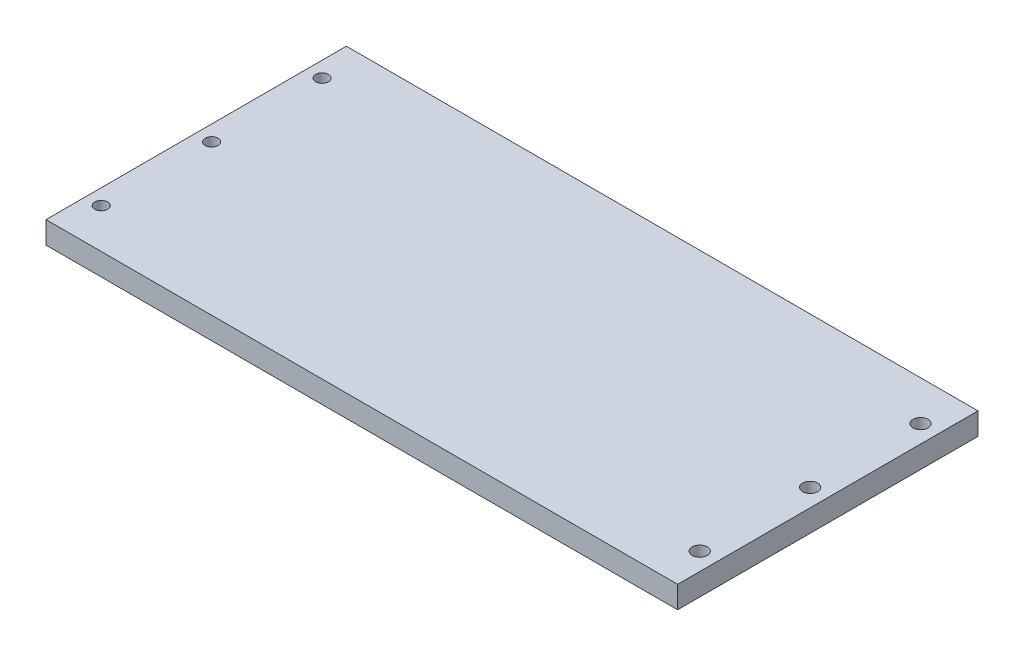
ISO-10303-21;
HEADER;
FILE_DESCRIPTION(('STEP AP214'),'2;1');
FILE_NAME('part.step','',(''),(''),'','','');
FILE_SCHEMA(('AUTOMOTIVE_DESIGN { 1 0 10303 214 1 1 1 1 }'));
ENDSEC;
DATA;
#1=APPLICATION_CONTEXT('core data for automotive mechanical design processes');
#2=APPLICATION_PROTOCOL_DEFINITION('international standard','automotive_design',2000,#1);
#3=PRODUCT_CONTEXT('',#1,'mechanical');
#4=PRODUCT('Part','Part','',(#3));
#5=PRODUCT_RELATED_PRODUCT_CATEGORY('part','',(#4));
#6=PRODUCT_DEFINITION_FORMATION('','',#4);
#7=PRODUCT_DEFINITION_CONTEXT('part definition',#1,'design');
#8=PRODUCT_DEFINITION('design','',#6,#7);
#9=PRODUCT_DEFINITION_SHAPE('','',#8);
#10=(LENGTH_UNIT() NAMED_UNIT(*) SI_UNIT(.MILLI.,.METRE.));
#11=(NAMED_UNIT(*) PLANE_ANGLE_UNIT() SI_UNIT($,.RADIAN.));
#12=(NAMED_UNIT(*) SI_UNIT($,.STERADIAN.) SOLID_ANGLE_UNIT());
#13=UNCERTAINTY_MEASURE_WITH_UNIT(LENGTH_MEASURE(1.E-05),#10,'distance_accuracy_value','');
#14=(GEOMETRIC_REPRESENTATION_CONTEXT(3) GLOBAL_UNCERTAINTY_ASSIGNED_CONTEXT((#13)) GLOBAL_UNIT_ASSIGNED_CONTEXT((#10,
#11,#12)) REPRESENTATION_CONTEXT('',''));
#15=CARTESIAN_POINT('',(0.,0.,0.));
#16=DIRECTION('',(0.,0.,1.));
#17=DIRECTION('',(1.,0.,0.));
#18=AXIS2_PLACEMENT_3D('',#15,#16,#17);
#19=CARTESIAN_POINT('',(71.5,5.,34.));
#20=DIRECTION('',(-1.,0.,0.));
#21=DIRECTION('',(0.,0.,1.));
#22=AXIS2_PLACEMENT_3D('',#19,#20,#21);
#23=PLANE('',#22);
#24=DIRECTION('',(0.,0.,-1.));
#25=VECTOR('',#24,1.);
#26=CARTESIAN_POINT('',(71.5,0.,34.));
#27=LINE('',#26,#25);
#28=CARTESIAN_POINT('',(71.5,0.,34.));
#29=VERTEX_POINT('',#28);
#30=CARTESIAN_POINT('',(71.5,0.,-34.));
#31=VERTEX_POINT('',#30);
#32=EDGE_CURVE('E108',#29,#31,#27,.T.);
#33=ORIENTED_EDGE('',*,*,#32,.T.);
#34=DIRECTION('',(0.,-1.,0.));
#35=VECTOR('',#34,1.);
#36=CARTESIAN_POINT('',(71.5,5.,-34.));
#37=LINE('',#36,#35);
#38=CARTESIAN_POINT('',(71.5,5.,-34.));
#39=VERTEX_POINT('',#38);
#40=EDGE_CURVE('E13',#39,#31,#37,.T.);
#41=ORIENTED_EDGE('',*,*,#40,.F.);
#42=DIRECTION('',(0.,0.,-1.));
#43=VECTOR('',#42,1.);
#44=CARTESIAN_POINT('',(71.5,5.,34.));
#45=LINE('',#44,#43);
#46=CARTESIAN_POINT('',(71.5,5.,34.));
#47=VERTEX_POINT('',#46);
#48=EDGE_CURVE('E96',#47,#39,#45,.T.);
#49=ORIENTED_EDGE('',*,*,#48,.F.);
#50=DIRECTION('',(0.,-1.,0.));
#51=VECTOR('',#50,1.);
#52=CARTESIAN_POINT('',(71.5,5.,34.));
#53=LINE('',#52,#51);
#54=EDGE_CURVE('E104',#47,#29,#53,.T.);
#55=ORIENTED_EDGE('',*,*,#54,.T.);
#56=EDGE_LOOP('',(#33,#41,#49,#55));
#57=FACE_BOUND('',#56,.T.);
#58=ADVANCED_FACE('F45',(#57),#23,.F.);
#59=CARTESIAN_POINT('',(-71.5,5.,-34.));
#60=DIRECTION('',(0.,0.,1.));
#61=DIRECTION('',(1.,0.,0.));
#62=AXIS2_PLACEMENT_3D('',#59,#60,#61);
#63=PLANE('',#62);
#64=DIRECTION('',(-1.,0.,0.));
#65=VECTOR('',#64,1.);
#66=CARTESIAN_POINT('',(-71.5,0.,-34.));
#67=LINE('',#66,#65);
#68=CARTESIAN_POINT('',(-71.5,0.,-34.));
#69=VERTEX_POINT('',#68);
#70=EDGE_CURVE('E100',#31,#69,#67,.T.);
#71=ORIENTED_EDGE('',*,*,#70,.T.);
#72=DIRECTION('',(0.,-1.,0.));
#73=VECTOR('',#72,1.);
#74=CARTESIAN_POINT('',(-71.5,5.,-34.));
#75=LINE('',#74,#73);
#76=CARTESIAN_POINT('',(-71.5,5.,-34.));
#77=VERTEX_POINT('',#76);
#78=EDGE_CURVE('E53',#77,#69,#75,.T.);
#79=ORIENTED_EDGE('',*,*,#78,.F.);
#80=DIRECTION('',(-1.,0.,0.));
#81=VECTOR('',#80,1.);
#82=CARTESIAN_POINT('',(-71.5,5.,-34.));
#83=LINE('',#82,#81);
#84=EDGE_CURVE('E91',#39,#77,#83,.T.);
#85=ORIENTED_EDGE('',*,*,#84,.F.);
#86=ORIENTED_EDGE('',*,*,#40,.T.);
#87=EDGE_LOOP('',(#71,#79,#85,#86));
#88=FACE_BOUND('',#87,.T.);
#89=ADVANCED_FACE('F99',(#88),#63,.F.);
#90=CARTESIAN_POINT('',(-71.5,5.,34.));
#91=DIRECTION('',(1.,0.,0.));
#92=DIRECTION('',(0.,0.,-1.));
#93=AXIS2_PLACEMENT_3D('',#90,#91,#92);
#94=PLANE('',#93);
#95=DIRECTION('',(0.,0.,1.));
#96=VECTOR('',#95,1.);
#97=CARTESIAN_POINT('',(-71.5,0.,34.));
#98=LINE('',#97,#96);
#99=CARTESIAN_POINT('',(-71.5,0.,34.));
#100=VERTEX_POINT('',#99);
#101=EDGE_CURVE('E78',#69,#100,#98,.T.);
#102=ORIENTED_EDGE('',*,*,#101,.T.);
#103=DIRECTION('',(0.,-1.,0.));
#104=VECTOR('',#103,1.);
#105=CARTESIAN_POINT('',(-71.5,5.,34.));
#106=LINE('',#105,#104);
#107=CARTESIAN_POINT('',(-71.5,5.,34.));
#108=VERTEX_POINT('',#107);
#109=EDGE_CURVE('E101',#108,#100,#106,.T.);
#110=ORIENTED_EDGE('',*,*,#109,.F.);
#111=DIRECTION('',(0.,0.,1.));
#112=VECTOR('',#111,1.);
#113=CARTESIAN_POINT('',(-71.5,5.,34.));
#114=LINE('',#113,#112);
#115=EDGE_CURVE('E94',#77,#108,#114,.T.);
#116=ORIENTED_EDGE('',*,*,#115,.F.);
#117=ORIENTED_EDGE('',*,*,#78,.T.);
#118=EDGE_LOOP('',(#102,#110,#116,#117));
#119=FACE_BOUND('',#118,.T.);
#120=ADVANCED_FACE('F102',(#119),#94,.F.);
#121=CARTESIAN_POINT('',(-71.5,5.,34.));
#122=DIRECTION('',(0.,0.,-1.));
#123=DIRECTION('',(-1.,0.,0.));
#124=AXIS2_PLACEMENT_3D('',#121,#122,#123);
#125=PLANE('',#124);
#126=DIRECTION('',(1.,0.,0.));
#127=VECTOR('',#126,1.);
#128=CARTESIAN_POINT('',(-71.5,0.,34.));
#129=LINE('',#128,#127);
#130=EDGE_CURVE('E84',#100,#29,#129,.T.);
#131=ORIENTED_EDGE('',*,*,#130,.T.);
#132=ORIENTED_EDGE('',*,*,#54,.F.);
#133=DIRECTION('',(1.,0.,0.));
#134=VECTOR('',#133,1.);
#135=CARTESIAN_POINT('',(-71.5,5.,34.));
#136=LINE('',#135,#134);
#137=EDGE_CURVE('E61',#108,#47,#136,.T.);
#138=ORIENTED_EDGE('',*,*,#137,.F.);
#139=ORIENTED_EDGE('',*,*,#109,.T.);
#140=EDGE_LOOP('',(#131,#132,#138,#139));
#141=FACE_BOUND('',#140,.T.);
#142=ADVANCED_FACE('F116',(#141),#125,.F.);
#143=CARTESIAN_POINT('',(0.,5.,0.));
#144=DIRECTION('',(0.,-1.,0.));
#145=DIRECTION('',(0.,0.,-1.));
#146=AXIS2_PLACEMENT_3D('',#143,#144,#145);
#147=PLANE('',#146);
#148=CARTESIAN_POINT('',(67.5,5.,-25.));
#149=DIRECTION('',(0.,-1.,0.));
#150=DIRECTION('',(0.,0.,-1.));
#151=AXIS2_PLACEMENT_3D('',#148,#149,#150);
#152=CIRCLE('',#151,1.69999999999999);
#153=CARTESIAN_POINT('',(67.5,5.,-26.7));
#154=VERTEX_POINT('',#153);
#155=EDGE_CURVE('E166',#154,#154,#152,.T.);
#156=ORIENTED_EDGE('',*,*,#155,.T.);
#157=EDGE_LOOP('',(#156));
#158=FACE_BOUND('',#157,.T.);
#159=CARTESIAN_POINT('',(67.5,5.,0.));
#160=DIRECTION('',(0.,-1.,0.));
#161=DIRECTION('',(0.,0.,-1.));
#162=AXIS2_PLACEMENT_3D('',#159,#160,#161);
#163=CIRCLE('',#162,1.69999999999999);
#164=CARTESIAN_POINT('',(67.5,5.,-1.69999999999999));
#165=VERTEX_POINT('',#164);
#166=EDGE_CURVE('E157',#165,#165,#163,.T.);
#167=ORIENTED_EDGE('',*,*,#166,.T.);
#168=EDGE_LOOP('',(#167));
#169=FACE_BOUND('',#168,.T.);
#170=CARTESIAN_POINT('',(67.5,5.,25.));
#171=DIRECTION('',(0.,-1.,0.));
#172=DIRECTION('',(0.,0.,-1.));
#173=AXIS2_PLACEMENT_3D('',#170,#171,#172);
#174=CIRCLE('',#173,1.69999999999999);
#175=CARTESIAN_POINT('',(67.5,5.,23.3));
#176=VERTEX_POINT('',#175);
#177=EDGE_CURVE('E148',#176,#176,#174,.T.);
#178=ORIENTED_EDGE('',*,*,#177,.T.);
#179=EDGE_LOOP('',(#178));
#180=FACE_BOUND('',#179,.T.);
#181=CARTESIAN_POINT('',(-68.,5.,-25.));
#182=DIRECTION('',(0.,-1.,0.));
#183=DIRECTION('',(0.,0.,-1.));
#184=AXIS2_PLACEMENT_3D('',#181,#182,#183);
#185=CIRCLE('',#184,1.44999999999999);
#186=CARTESIAN_POINT('',(-68.,5.,-26.45));
#187=VERTEX_POINT('',#186);
#188=EDGE_CURVE('E139',#187,#187,#185,.T.);
#189=ORIENTED_EDGE('',*,*,#188,.T.);
#190=EDGE_LOOP('',(#189));
#191=FACE_BOUND('',#190,.T.);
#192=CARTESIAN_POINT('',(-68.,5.,0.));
#193=DIRECTION('',(0.,-1.,0.));
#194=DIRECTION('',(0.,0.,-1.));
#195=AXIS2_PLACEMENT_3D('',#192,#193,#194);
#196=CIRCLE('',#195,1.44999999999999);
#197=CARTESIAN_POINT('',(-68.,5.,-1.44999999999999));
#198=VERTEX_POINT('',#197);
#199=EDGE_CURVE('E130',#198,#198,#196,.T.);
#200=ORIENTED_EDGE('',*,*,#199,.T.);
#201=EDGE_LOOP('',(#200));
#202=FACE_BOUND('',#201,.T.);
#203=CARTESIAN_POINT('',(-68.,5.,25.));
#204=DIRECTION('',(0.,-1.,0.));
#205=DIRECTION('',(0.,0.,-1.));
#206=AXIS2_PLACEMENT_3D('',#203,#204,#205);
#207=CIRCLE('',#206,1.44999999999999);
#208=CARTESIAN_POINT('',(-68.,5.,23.55));
#209=VERTEX_POINT('',#208);
#210=EDGE_CURVE('E111',#209,#209,#207,.T.);
#211=ORIENTED_EDGE('',*,*,#210,.T.);
#212=EDGE_LOOP('',(#211));
#213=FACE_BOUND('',#212,.T.);
#214=ORIENTED_EDGE('',*,*,#48,.T.);
#215=ORIENTED_EDGE('',*,*,#84,.T.);
#216=ORIENTED_EDGE('',*,*,#115,.T.);
#217=ORIENTED_EDGE('',*,*,#137,.T.);
#218=EDGE_LOOP('',(#214,#215,#216,#217));
#219=FACE_BOUND('',#218,.T.);
#220=ADVANCED_FACE('F92',(#158,#169,#180,#191,#202,#213,#219),#147,.F.);
#221=CARTESIAN_POINT('',(0.,0.,0.));
#222=DIRECTION('',(0.,-1.,0.));
#223=DIRECTION('',(0.,0.,-1.));
#224=AXIS2_PLACEMENT_3D('',#221,#222,#223);
#225=PLANE('',#224);
#226=CARTESIAN_POINT('',(67.5,0.,-25.));
#227=DIRECTION('',(0.,-1.,0.));
#228=DIRECTION('',(0.,0.,-1.));
#229=AXIS2_PLACEMENT_3D('',#226,#227,#228);
#230=CIRCLE('',#229,3.15);
#231=CARTESIAN_POINT('',(67.5,0.,-28.15));
#232=VERTEX_POINT('',#231);
#233=EDGE_CURVE('E172',#232,#232,#230,.T.);
#234=ORIENTED_EDGE('',*,*,#233,.F.);
#235=EDGE_LOOP('',(#234));
#236=FACE_BOUND('',#235,.T.);
#237=CARTESIAN_POINT('',(67.5,0.,0.));
#238=DIRECTION('',(0.,-1.,0.));
#239=DIRECTION('',(0.,0.,-1.));
#240=AXIS2_PLACEMENT_3D('',#237,#238,#239);
#241=CIRCLE('',#240,3.15);
#242=CARTESIAN_POINT('',(67.5,0.,-3.15));
#243=VERTEX_POINT('',#242);
#244=EDGE_CURVE('E163',#243,#243,#241,.T.);
#245=ORIENTED_EDGE('',*,*,#244,.F.);
#246=EDGE_LOOP('',(#245));
#247=FACE_BOUND('',#246,.T.);
#248=CARTESIAN_POINT('',(67.5,0.,25.));
#249=DIRECTION('',(0.,-1.,0.));
#250=DIRECTION('',(0.,0.,-1.));
#251=AXIS2_PLACEMENT_3D('',#248,#249,#250);
#252=CIRCLE('',#251,3.15);
#253=CARTESIAN_POINT('',(67.5,0.,21.85));
#254=VERTEX_POINT('',#253);
#255=EDGE_CURVE('E154',#254,#254,#252,.T.);
#256=ORIENTED_EDGE('',*,*,#255,.F.);
#257=EDGE_LOOP('',(#256));
#258=FACE_BOUND('',#257,.T.);
#259=CARTESIAN_POINT('',(-68.,0.,-25.));
#260=DIRECTION('',(0.,-1.,0.));
#261=DIRECTION('',(0.,0.,-1.));
#262=AXIS2_PLACEMENT_3D('',#259,#260,#261);
#263=CIRCLE('',#262,2.75);
#264=CARTESIAN_POINT('',(-68.,0.,-27.75));
#265=VERTEX_POINT('',#264);
#266=EDGE_CURVE('E145',#265,#265,#263,.T.);
#267=ORIENTED_EDGE('',*,*,#266,.F.);
#268=EDGE_LOOP('',(#267));
#269=FACE_BOUND('',#268,.T.);
#270=CARTESIAN_POINT('',(-68.,0.,0.));
#271=DIRECTION('',(0.,-1.,0.));
#272=DIRECTION('',(0.,0.,-1.));
#273=AXIS2_PLACEMENT_3D('',#270,#271,#272);
#274=CIRCLE('',#273,2.75);
#275=CARTESIAN_POINT('',(-68.,0.,-2.75));
#276=VERTEX_POINT('',#275);
#277=EDGE_CURVE('E136',#276,#276,#274,.T.);
#278=ORIENTED_EDGE('',*,*,#277,.F.);
#279=EDGE_LOOP('',(#278));
#280=FACE_BOUND('',#279,.T.);
#281=CARTESIAN_POINT('',(-68.,0.,25.));
#282=DIRECTION('',(0.,-1.,0.));
#283=DIRECTION('',(0.,0.,-1.));
#284=AXIS2_PLACEMENT_3D('',#281,#282,#283);
#285=CIRCLE('',#284,2.75);
#286=CARTESIAN_POINT('',(-68.,0.,22.25));
#287=VERTEX_POINT('',#286);
#288=EDGE_CURVE('E127',#287,#287,#285,.T.);
#289=ORIENTED_EDGE('',*,*,#288,.F.);
#290=EDGE_LOOP('',(#289));
#291=FACE_BOUND('',#290,.T.);
#292=ORIENTED_EDGE('',*,*,#32,.F.);
#293=ORIENTED_EDGE('',*,*,#130,.F.);
#294=ORIENTED_EDGE('',*,*,#101,.F.);
#295=ORIENTED_EDGE('',*,*,#70,.F.);
#296=EDGE_LOOP('',(#292,#293,#294,#295));
#297=FACE_BOUND('',#296,.T.);
#298=ADVANCED_FACE('F119',(#236,#247,#258,#269,#280,#291,#297),#225,.T.);
#299=CARTESIAN_POINT('',(-68.,0.,25.));
#300=DIRECTION('',(0.,-1.,0.));
#301=DIRECTION('',(0.,0.,-1.));
#302=AXIS2_PLACEMENT_3D('',#299,#300,#301);
#303=CYLINDRICAL_SURFACE('',#302,1.44999999999999);
#304=ORIENTED_EDGE('',*,*,#210,.F.);
#305=EDGE_LOOP('',(#304));
#306=FACE_BOUND('',#305,.T.);
#307=CARTESIAN_POINT('',(-68.,1.3,25.));
#308=DIRECTION('',(0.,-1.,0.));
#309=DIRECTION('',(0.,0.,-1.));
#310=AXIS2_PLACEMENT_3D('',#307,#308,#309);
#311=CIRCLE('',#310,1.44999999999999);
#312=CARTESIAN_POINT('',(-68.,1.3,23.55));
#313=VERTEX_POINT('',#312);
#314=EDGE_CURVE('E124',#313,#313,#311,.T.);
#315=ORIENTED_EDGE('',*,*,#314,.T.);
#316=EDGE_LOOP('',(#315));
#317=FACE_BOUND('',#316,.T.);
#318=ADVANCED_FACE('F180',(#306,#317),#303,.F.);
#319=CARTESIAN_POINT('',(-68.,0.,25.));
#320=DIRECTION('',(0.,-1.,0.));
#321=DIRECTION('',(0.,0.,-1.));
#322=AXIS2_PLACEMENT_3D('',#319,#320,#321);
#323=CONICAL_SURFACE('',#322,2.75,0.785398163397452);
#324=ORIENTED_EDGE('',*,*,#314,.F.);
#325=EDGE_LOOP('',(#324));
#326=FACE_BOUND('',#325,.T.);
#327=ORIENTED_EDGE('',*,*,#288,.T.);
#328=EDGE_LOOP('',(#327));
#329=FACE_BOUND('',#328,.T.);
#330=ADVANCED_FACE('F192',(#326,#329),#323,.F.);
#331=CARTESIAN_POINT('',(-68.,0.,0.));
#332=DIRECTION('',(0.,-1.,0.));
#333=DIRECTION('',(0.,0.,-1.));
#334=AXIS2_PLACEMENT_3D('',#331,#332,#333);
#335=CYLINDRICAL_SURFACE('',#334,1.44999999999999);
#336=ORIENTED_EDGE('',*,*,#199,.F.);
#337=EDGE_LOOP('',(#336));
#338=FACE_BOUND('',#337,.T.);
#339=CARTESIAN_POINT('',(-68.,1.3,0.));
#340=DIRECTION('',(0.,-1.,0.));
#341=DIRECTION('',(0.,0.,-1.));
#342=AXIS2_PLACEMENT_3D('',#339,#340,#341);
#343=CIRCLE('',#342,1.44999999999999);
#344=CARTESIAN_POINT('',(-68.,1.3,-1.44999999999999));
#345=VERTEX_POINT('',#344);
#346=EDGE_CURVE('E133',#345,#345,#343,.T.);
#347=ORIENTED_EDGE('',*,*,#346,.T.);
#348=EDGE_LOOP('',(#347));
#349=FACE_BOUND('',#348,.T.);
#350=ADVANCED_FACE('F194',(#338,#349),#335,.F.);
#351=CARTESIAN_POINT('',(-68.,0.,0.));
#352=DIRECTION('',(0.,-1.,0.));
#353=DIRECTION('',(0.,0.,-1.));
#354=AXIS2_PLACEMENT_3D('',#351,#352,#353);
#355=CONICAL_SURFACE('',#354,2.75,0.785398163397452);
#356=ORIENTED_EDGE('',*,*,#346,.F.);
#357=EDGE_LOOP('',(#356));
#358=FACE_BOUND('',#357,.T.);
#359=ORIENTED_EDGE('',*,*,#277,.T.);
#360=EDGE_LOOP('',(#359));
#361=FACE_BOUND('',#360,.T.);
#362=ADVANCED_FACE('F201',(#358,#361),#355,.F.);
#363=CARTESIAN_POINT('',(-68.,0.,-25.));
#364=DIRECTION('',(0.,-1.,0.));
#365=DIRECTION('',(0.,0.,-1.));
#366=AXIS2_PLACEMENT_3D('',#363,#364,#365);
#367=CYLINDRICAL_SURFACE('',#366,1.44999999999999);
#368=ORIENTED_EDGE('',*,*,#188,.F.);
#369=EDGE_LOOP('',(#368));
#370=FACE_BOUND('',#369,.T.);
#371=CARTESIAN_POINT('',(-68.,1.3,-25.));
#372=DIRECTION('',(0.,-1.,0.));
#373=DIRECTION('',(0.,0.,-1.));
#374=AXIS2_PLACEMENT_3D('',#371,#372,#373);
#375=CIRCLE('',#374,1.44999999999999);
#376=CARTESIAN_POINT('',(-68.,1.3,-26.45));
#377=VERTEX_POINT('',#376);
#378=EDGE_CURVE('E142',#377,#377,#375,.T.);
#379=ORIENTED_EDGE('',*,*,#378,.T.);
#380=EDGE_LOOP('',(#379));
#381=FACE_BOUND('',#380,.T.);
#382=ADVANCED_FACE('F239',(#370,#381),#367,.F.);
#383=CARTESIAN_POINT('',(-68.,0.,-25.));
#384=DIRECTION('',(0.,-1.,0.));
#385=DIRECTION('',(0.,0.,-1.));
#386=AXIS2_PLACEMENT_3D('',#383,#384,#385);
#387=CONICAL_SURFACE('',#386,2.75,0.785398163397452);
#388=ORIENTED_EDGE('',*,*,#378,.F.);
#389=EDGE_LOOP('',(#388));
#390=FACE_BOUND('',#389,.T.);
#391=ORIENTED_EDGE('',*,*,#266,.T.);
#392=EDGE_LOOP('',(#391));
#393=FACE_BOUND('',#392,.T.);
#394=ADVANCED_FACE('F244',(#390,#393),#387,.F.);
#395=CARTESIAN_POINT('',(67.5,0.,25.));
#396=DIRECTION('',(0.,-1.,0.));
#397=DIRECTION('',(0.,0.,-1.));
#398=AXIS2_PLACEMENT_3D('',#395,#396,#397);
#399=CYLINDRICAL_SURFACE('',#398,1.69999999999999);
#400=ORIENTED_EDGE('',*,*,#177,.F.);
#401=EDGE_LOOP('',(#400));
#402=FACE_BOUND('',#401,.T.);
#403=CARTESIAN_POINT('',(67.5,1.45,25.));
#404=DIRECTION('',(0.,-1.,0.));
#405=DIRECTION('',(0.,0.,-1.));
#406=AXIS2_PLACEMENT_3D('',#403,#404,#405);
#407=CIRCLE('',#406,1.69999999999999);
#408=CARTESIAN_POINT('',(67.5,1.45,23.3));
#409=VERTEX_POINT('',#408);
#410=EDGE_CURVE('E151',#409,#409,#407,.T.);
#411=ORIENTED_EDGE('',*,*,#410,.T.);
#412=EDGE_LOOP('',(#411));
#413=FACE_BOUND('',#412,.T.);
#414=ADVANCED_FACE('F250',(#402,#413),#399,.F.);
#415=CARTESIAN_POINT('',(67.5,0.,25.));
#416=DIRECTION('',(0.,-1.,0.));
#417=DIRECTION('',(0.,0.,-1.));
#418=AXIS2_PLACEMENT_3D('',#415,#416,#417);
#419=CONICAL_SURFACE('',#418,3.15,0.78539816339745);
#420=ORIENTED_EDGE('',*,*,#410,.F.);
#421=EDGE_LOOP('',(#420));
#422=FACE_BOUND('',#421,.T.);
#423=ORIENTED_EDGE('',*,*,#255,.T.);
#424=EDGE_LOOP('',(#423));
#425=FACE_BOUND('',#424,.T.);
#426=ADVANCED_FACE('F254',(#422,#425),#419,.F.);
#427=CARTESIAN_POINT('',(67.5,0.,0.));
#428=DIRECTION('',(0.,-1.,0.));
#429=DIRECTION('',(0.,0.,-1.));
#430=AXIS2_PLACEMENT_3D('',#427,#428,#429);
#431=CYLINDRICAL_SURFACE('',#430,1.69999999999999);
#432=ORIENTED_EDGE('',*,*,#166,.F.);
#433=EDGE_LOOP('',(#432));
#434=FACE_BOUND('',#433,.T.);
#435=CARTESIAN_POINT('',(67.5,1.45,0.));
#436=DIRECTION('',(0.,-1.,0.));
#437=DIRECTION('',(0.,0.,-1.));
#438=AXIS2_PLACEMENT_3D('',#435,#436,#437);
#439=CIRCLE('',#438,1.69999999999999);
#440=CARTESIAN_POINT('',(67.5,1.45,-1.69999999999999));
#441=VERTEX_POINT('',#440);
#442=EDGE_CURVE('E160',#441,#441,#439,.T.);
#443=ORIENTED_EDGE('',*,*,#442,.T.);
#444=EDGE_LOOP('',(#443));
#445=FACE_BOUND('',#444,.T.);
#446=ADVANCED_FACE('F258',(#434,#445),#431,.F.);
#447=CARTESIAN_POINT('',(67.5,0.,0.));
#448=DIRECTION('',(0.,-1.,0.));
#449=DIRECTION('',(0.,0.,-1.));
#450=AXIS2_PLACEMENT_3D('',#447,#448,#449);
#451=CONICAL_SURFACE('',#450,3.15,0.78539816339745);
#452=ORIENTED_EDGE('',*,*,#442,.F.);
#453=EDGE_LOOP('',(#452));
#454=FACE_BOUND('',#453,.T.);
#455=ORIENTED_EDGE('',*,*,#244,.T.);
#456=EDGE_LOOP('',(#455));
#457=FACE_BOUND('',#456,.T.);
#458=ADVANCED_FACE('F262',(#454,#457),#451,.F.);
#459=CARTESIAN_POINT('',(67.5,0.,-25.));
#460=DIRECTION('',(0.,-1.,0.));
#461=DIRECTION('',(0.,0.,-1.));
#462=AXIS2_PLACEMENT_3D('',#459,#460,#461);
#463=CYLINDRICAL_SURFACE('',#462,1.69999999999999);
#464=ORIENTED_EDGE('',*,*,#155,.F.);
#465=EDGE_LOOP('',(#464));
#466=FACE_BOUND('',#465,.T.);
#467=CARTESIAN_POINT('',(67.5,1.45,-25.));
#468=DIRECTION('',(0.,-1.,0.));
#469=DIRECTION('',(0.,0.,-1.));
#470=AXIS2_PLACEMENT_3D('',#467,#468,#469);
#471=CIRCLE('',#470,1.69999999999999);
#472=CARTESIAN_POINT('',(67.5,1.45,-26.7));
#473=VERTEX_POINT('',#472);
#474=EDGE_CURVE('E169',#473,#473,#471,.T.);
#475=ORIENTED_EDGE('',*,*,#474,.T.);
#476=EDGE_LOOP('',(#475));
#477=FACE_BOUND('',#476,.T.);
#478=ADVANCED_FACE('F266',(#466,#477),#463,.F.);
#479=CARTESIAN_POINT('',(67.5,0.,-25.));
#480=DIRECTION('',(0.,-1.,0.));
#481=DIRECTION('',(0.,0.,-1.));
#482=AXIS2_PLACEMENT_3D('',#479,#480,#481);
#483=CONICAL_SURFACE('',#482,3.15,0.78539816339745);
#484=ORIENTED_EDGE('',*,*,#474,.F.);
#485=EDGE_LOOP('',(#484));
#486=FACE_BOUND('',#485,.T.);
#487=ORIENTED_EDGE('',*,*,#233,.T.);
#488=EDGE_LOOP('',(#487));
#489=FACE_BOUND('',#488,.T.);
#490=ADVANCED_FACE('F176',(#486,#489),#483,.F.);
#491=CLOSED_SHELL('',(#58,#89,#120,#142,#220,#298,#318,#330,#350,#362,#382,#394,#414,#426,#446,
#458,#478,#490));
#492=MANIFOLD_SOLID_BREP('B2',#491);
#493=ADVANCED_BREP_SHAPE_REPRESENTATION('',(#18,#492),#14);
#494=SHAPE_DEFINITION_REPRESENTATION(#9,#493);
ENDSEC;
END-ISO-10303-21;
